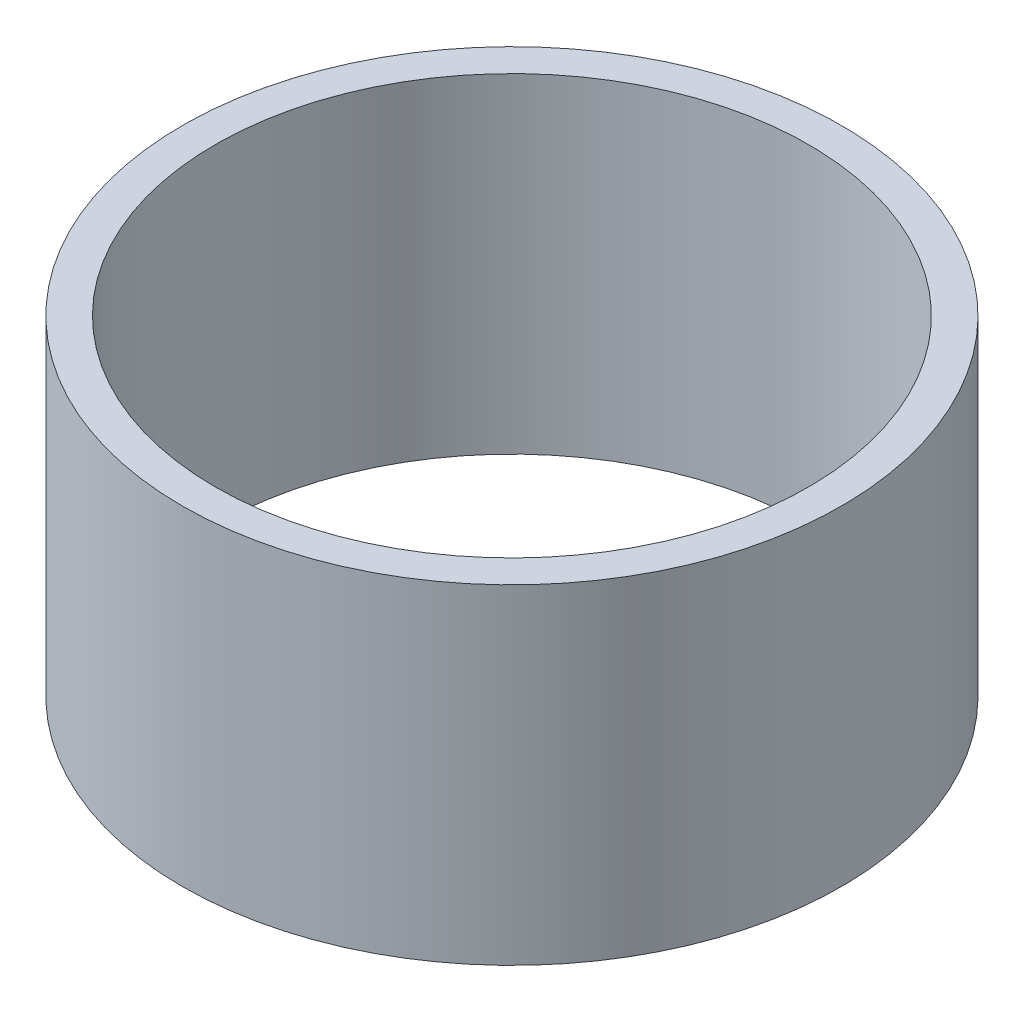
ISO-10303-21;
HEADER;
FILE_DESCRIPTION(('STEP AP214'),'2;1');
FILE_NAME('part.step','',(''),(''),'','','');
FILE_SCHEMA(('AUTOMOTIVE_DESIGN { 1 0 10303 214 1 1 1 1 }'));
ENDSEC;
DATA;
#1=APPLICATION_CONTEXT('core data for automotive mechanical design processes');
#2=APPLICATION_PROTOCOL_DEFINITION('international standard','automotive_design',2000,#1);
#3=PRODUCT_CONTEXT('',#1,'mechanical');
#4=PRODUCT('Part','Part','',(#3));
#5=PRODUCT_RELATED_PRODUCT_CATEGORY('part','',(#4));
#6=PRODUCT_DEFINITION_FORMATION('','',#4);
#7=PRODUCT_DEFINITION_CONTEXT('part definition',#1,'design');
#8=PRODUCT_DEFINITION('design','',#6,#7);
#9=PRODUCT_DEFINITION_SHAPE('','',#8);
#10=(LENGTH_UNIT() NAMED_UNIT(*) SI_UNIT(.MILLI.,.METRE.));
#11=(NAMED_UNIT(*) PLANE_ANGLE_UNIT() SI_UNIT($,.RADIAN.));
#12=(NAMED_UNIT(*) SI_UNIT($,.STERADIAN.) SOLID_ANGLE_UNIT());
#13=UNCERTAINTY_MEASURE_WITH_UNIT(LENGTH_MEASURE(1.E-05),#10,'distance_accuracy_value','');
#14=(GEOMETRIC_REPRESENTATION_CONTEXT(3) GLOBAL_UNCERTAINTY_ASSIGNED_CONTEXT((#13)) GLOBAL_UNIT_ASSIGNED_CONTEXT((#10,
#11,#12)) REPRESENTATION_CONTEXT('',''));
#15=CARTESIAN_POINT('',(0.,0.,0.));
#16=DIRECTION('',(0.,0.,1.));
#17=DIRECTION('',(1.,0.,0.));
#18=AXIS2_PLACEMENT_3D('',#15,#16,#17);
#19=CARTESIAN_POINT('',(0.,50.,0.));
#20=DIRECTION('',(0.,1.,0.));
#21=DIRECTION('',(0.,0.,1.));
#22=AXIS2_PLACEMENT_3D('',#19,#20,#21);
#23=PLANE('',#22);
#24=CARTESIAN_POINT('',(0.,50.,0.));
#25=DIRECTION('',(0.,1.,0.));
#26=DIRECTION('',(0.,0.,1.));
#27=AXIS2_PLACEMENT_3D('',#24,#25,#26);
#28=CIRCLE('',#27,50.);
#29=CARTESIAN_POINT('',(0.,50.,50.));
#30=VERTEX_POINT('',#29);
#31=EDGE_CURVE('E136',#30,#30,#28,.T.);
#32=ORIENTED_EDGE('',*,*,#31,.T.);
#33=EDGE_LOOP('',(#32));
#34=FACE_BOUND('',#33,.T.);
#35=CARTESIAN_POINT('',(0.,50.,0.));
#36=DIRECTION('',(0.,1.,0.));
#37=DIRECTION('',(0.,0.,1.));
#38=AXIS2_PLACEMENT_3D('',#35,#36,#37);
#39=CIRCLE('',#38,45.);
#40=CARTESIAN_POINT('',(0.,50.,45.));
#41=VERTEX_POINT('',#40);
#42=EDGE_CURVE('E129',#41,#41,#39,.T.);
#43=ORIENTED_EDGE('',*,*,#42,.F.);
#44=EDGE_LOOP('',(#43));
#45=FACE_BOUND('',#44,.T.);
#46=ADVANCED_FACE('F47',(#34,#45),#23,.T.);
#47=CARTESIAN_POINT('',(0.,0.,0.));
#48=DIRECTION('',(0.,1.,0.));
#49=DIRECTION('',(0.,0.,1.));
#50=AXIS2_PLACEMENT_3D('',#47,#48,#49);
#51=PLANE('',#50);
#52=CARTESIAN_POINT('',(0.,0.,36.6101500815682));
#53=DIRECTION('',(0.,-1.,0.));
#54=DIRECTION('',(0.,0.,-1.));
#55=AXIS2_PLACEMENT_3D('',#52,#53,#54);
#56=CIRCLE('',#55,5.15874);
#57=CARTESIAN_POINT('',(0.,0.,31.4514100815682));
#58=VERTEX_POINT('',#57);
#59=EDGE_CURVE('E256',#58,#58,#56,.T.);
#60=ORIENTED_EDGE('',*,*,#59,.F.);
#61=EDGE_LOOP('',(#60));
#62=FACE_BOUND('',#61,.T.);
#63=CARTESIAN_POINT('',(0.,0.,0.));
#64=DIRECTION('',(0.,1.,0.));
#65=DIRECTION('',(0.,0.,1.));
#66=AXIS2_PLACEMENT_3D('',#63,#64,#65);
#67=CIRCLE('',#66,50.);
#68=CARTESIAN_POINT('',(0.,0.,50.));
#69=VERTEX_POINT('',#68);
#70=EDGE_CURVE('E133',#69,#69,#67,.T.);
#71=ORIENTED_EDGE('',*,*,#70,.F.);
#72=EDGE_LOOP('',(#71));
#73=FACE_BOUND('',#72,.T.);
#74=CARTESIAN_POINT('',(0.,0.,0.));
#75=DIRECTION('',(0.,1.,0.));
#76=DIRECTION('',(0.,0.,1.));
#77=AXIS2_PLACEMENT_3D('',#74,#75,#76);
#78=CIRCLE('',#77,45.);
#79=CARTESIAN_POINT('',(12.7,0.,43.1707076615614));
#80=VERTEX_POINT('',#79);
#81=CARTESIAN_POINT('',(-12.7,0.,43.1707076615614));
#82=VERTEX_POINT('',#81);
#83=EDGE_CURVE('E102',#80,#82,#78,.T.);
#84=ORIENTED_EDGE('',*,*,#83,.T.);
#85=DIRECTION('',(0.,0.,-1.));
#86=VECTOR('',#85,1.);
#87=CARTESIAN_POINT('',(-12.7,0.,0.));
#88=LINE('',#87,#86);
#89=CARTESIAN_POINT('',(-12.7,0.,36.6101500815682));
#90=VERTEX_POINT('',#89);
#91=EDGE_CURVE('E95',#82,#90,#88,.T.);
#92=ORIENTED_EDGE('',*,*,#91,.T.);
#93=CARTESIAN_POINT('',(0.,0.,36.6101500815682));
#94=DIRECTION('',(0.,1.,0.));
#95=DIRECTION('',(0.,0.,1.));
#96=AXIS2_PLACEMENT_3D('',#93,#94,#95);
#97=CIRCLE('',#96,12.7);
#98=CARTESIAN_POINT('',(12.7,0.,36.6101500815682));
#99=VERTEX_POINT('',#98);
#100=EDGE_CURVE('E106',#99,#90,#97,.T.);
#101=ORIENTED_EDGE('',*,*,#100,.F.);
#102=DIRECTION('',(0.,0.,-1.));
#103=VECTOR('',#102,1.);
#104=CARTESIAN_POINT('',(12.7,0.,0.));
#105=LINE('',#104,#103);
#106=EDGE_CURVE('E115',#80,#99,#105,.T.);
#107=ORIENTED_EDGE('',*,*,#106,.F.);
#108=EDGE_LOOP('',(#84,#92,#101,#107));
#109=FACE_BOUND('',#108,.T.);
#110=ADVANCED_FACE('F112',(#62,#73,#109),#51,.F.);
#111=CARTESIAN_POINT('',(0.,50.,0.));
#112=DIRECTION('',(0.,-1.,0.));
#113=DIRECTION('',(0.,0.,-1.));
#114=AXIS2_PLACEMENT_3D('',#111,#112,#113);
#115=CYLINDRICAL_SURFACE('',#114,50.);
#116=ORIENTED_EDGE('',*,*,#31,.F.);
#117=EDGE_LOOP('',(#116));
#118=FACE_BOUND('',#117,.T.);
#119=ORIENTED_EDGE('',*,*,#70,.T.);
#120=EDGE_LOOP('',(#119));
#121=FACE_BOUND('',#120,.T.);
#122=ADVANCED_FACE('F170',(#118,#121),#115,.T.);
#123=CARTESIAN_POINT('',(0.,50.,0.));
#124=DIRECTION('',(0.,-1.,0.));
#125=DIRECTION('',(0.,0.,-1.));
#126=AXIS2_PLACEMENT_3D('',#123,#124,#125);
#127=CYLINDRICAL_SURFACE('',#126,45.);
#128=DIRECTION('',(0.,-1.,0.));
#129=VECTOR('',#128,1.);
#130=CARTESIAN_POINT('',(12.7,5.,43.1707076615614));
#131=LINE('',#130,#129);
#132=CARTESIAN_POINT('',(12.7,35.0000000000002,43.1707076615614));
#133=VERTEX_POINT('',#132);
#134=EDGE_CURVE('E123',#133,#80,#131,.T.);
#135=ORIENTED_EDGE('',*,*,#134,.F.);
#136=CARTESIAN_POINT('',(0.,35.0000000000002,0.));
#137=DIRECTION('',(0.,1.,0.));
#138=DIRECTION('',(0.,0.,1.));
#139=AXIS2_PLACEMENT_3D('',#136,#137,#138);
#140=CIRCLE('',#139,45.);
#141=CARTESIAN_POINT('',(-12.7,35.0000000000002,43.1707076615614));
#142=VERTEX_POINT('',#141);
#143=EDGE_CURVE('E140',#133,#142,#140,.F.);
#144=ORIENTED_EDGE('',*,*,#143,.T.);
#145=DIRECTION('',(0.,-1.,0.));
#146=VECTOR('',#145,1.);
#147=CARTESIAN_POINT('',(-12.7,5.,43.1707076615614));
#148=LINE('',#147,#146);
#149=EDGE_CURVE('E103',#142,#82,#148,.T.);
#150=ORIENTED_EDGE('',*,*,#149,.T.);
#151=ORIENTED_EDGE('',*,*,#83,.F.);
#152=EDGE_LOOP('',(#135,#144,#150,#151));
#153=FACE_BOUND('',#152,.T.);
#154=ORIENTED_EDGE('',*,*,#42,.T.);
#155=EDGE_LOOP('',(#154));
#156=FACE_BOUND('',#155,.T.);
#157=ADVANCED_FACE('F167',(#153,#156),#127,.F.);
#158=CARTESIAN_POINT('',(0.,5.,36.6101500815682));
#159=DIRECTION('',(0.,-1.,0.));
#160=DIRECTION('',(0.,0.,-1.));
#161=AXIS2_PLACEMENT_3D('',#158,#159,#160);
#162=CYLINDRICAL_SURFACE('',#161,12.7);
#163=ORIENTED_EDGE('',*,*,#100,.T.);
#164=DIRECTION('',(0.,-1.,0.));
#165=VECTOR('',#164,1.);
#166=CARTESIAN_POINT('',(-12.7,5.,36.6101500815682));
#167=LINE('',#166,#165);
#168=CARTESIAN_POINT('',(-12.7,28.7503946946991,36.6101500815682));
#169=VERTEX_POINT('',#168);
#170=EDGE_CURVE('E90',#169,#90,#167,.T.);
#171=ORIENTED_EDGE('',*,*,#170,.F.);
#172=CARTESIAN_POINT('',(-12.7,28.7503946946991,36.6101500815682));
#173=CARTESIAN_POINT('',(-12.6999922653262,28.513172893472,36.3590576179907));
#174=CARTESIAN_POINT('',(-12.6925537414756,28.2748341434454,36.1090944388542));
#175=CARTESIAN_POINT('',(-12.663156616301,27.7962604742258,35.6118884641788));
#176=CARTESIAN_POINT('',(-12.6411992163265,27.5560257135411,35.3646454452837));
#177=CARTESIAN_POINT('',(-12.5540788027013,26.8330892207903,34.6277947984313));
#178=CARTESIAN_POINT('',(-12.4676671016097,26.3479929715185,34.1428936420159));
#179=CARTESIAN_POINT('',(-12.2389407046088,25.3680971473796,33.1830383102579));
#180=CARTESIAN_POINT('',(-12.095890250895,24.8732547863921,32.7083054248262));
#181=CARTESIAN_POINT('',(-11.7555560175217,23.8834145637274,31.7788102730223));
#182=CARTESIAN_POINT('',(-11.558271869945,23.3884167010183,31.3240481421544));
#183=CARTESIAN_POINT('',(-11.1092028611528,22.3996799863462,30.4356414259774));
#184=CARTESIAN_POINT('',(-10.857173793942,21.9059571447142,30.0021024897511));
#185=CARTESIAN_POINT('',(-10.2985865078681,20.9262415097577,29.161391273466));
#186=CARTESIAN_POINT('',(-9.99200629699215,20.4402519204606,28.7542297179543));
#187=CARTESIAN_POINT('',(-9.49098223408561,19.7234464747141,28.1675905788065));
#188=CARTESIAN_POINT('',(-9.31764131135387,19.4871664932865,27.9765478650263));
#189=CARTESIAN_POINT('',(-8.95660496010887,19.0191109180492,27.6025527012946));
#190=CARTESIAN_POINT('',(-8.76890837101157,18.7873356903299,27.4196009073446));
#191=CARTESIAN_POINT('',(-8.37888563992011,18.3297928116435,27.0626854701264));
#192=CARTESIAN_POINT('',(-8.17657524529225,18.1040190423707,26.8887124883048));
#193=CARTESIAN_POINT('',(-7.75654859456847,17.6597926601407,26.5503954784911));
#194=CARTESIAN_POINT('',(-7.53883662687552,17.4413380340166,26.3860487932758));
#195=CARTESIAN_POINT('',(-7.12167074573794,17.0462739849511,26.0922334873718));
#196=CARTESIAN_POINT('',(-6.92450125786551,16.8683664957864,25.9612698290259));
#197=CARTESIAN_POINT('',(-6.51801818460892,16.5206452269798,25.7077271011594));
#198=CARTESIAN_POINT('',(-6.30870596796842,16.3508305390227,25.5851470900045));
#199=CARTESIAN_POINT('',(-5.87742534568287,16.0211283875659,25.3493234130555));
#200=CARTESIAN_POINT('',(-5.65546110367858,15.8612376939615,25.2360767054408));
#201=CARTESIAN_POINT('',(-5.19848691972995,15.5536398519924,25.0200815776086));
#202=CARTESIAN_POINT('',(-4.96347845218198,15.4059313313422,24.9173319746114));
#203=CARTESIAN_POINT('',(-4.31363939936346,15.0288499219311,24.6571064011031));
#204=CARTESIAN_POINT('',(-3.88607302410239,14.8129901862356,24.5104587101472));
#205=CARTESIAN_POINT('',(-3.21787122334546,14.5334252209164,24.3223969248805));
#206=CARTESIAN_POINT('',(-2.99074630283212,14.4476300249455,24.2650424870577));
#207=CARTESIAN_POINT('',(-2.52816000882595,14.2929535997945,24.1620797198145));
#208=CARTESIAN_POINT('',(-2.29270079831681,14.224068018388,24.1164683677899));
#209=CARTESIAN_POINT('',(-1.86133068427518,14.1169661248711,24.0457748458819));
#210=CARTESIAN_POINT('',(-1.6666194297696,14.0753917737449,24.0184260840143));
#211=CARTESIAN_POINT('',(-1.27378542037653,14.0056736008079,23.9726446154819));
#212=CARTESIAN_POINT('',(-1.07566340190389,13.9775269166056,23.9542100085649));
#213=CARTESIAN_POINT('',(-0.677391816726672,13.9354230012076,23.9266584820263));
#214=CARTESIAN_POINT('',(-0.477243608840231,13.9214568242515,23.9175356880367));
#215=CARTESIAN_POINT('',(-0.076244597202574,13.9080771688714,23.9087956871048));
#216=CARTESIAN_POINT('',(0.12460622221837,13.9086640171064,23.909178693531));
#217=CARTESIAN_POINT('',(0.525462663568599,13.9243737444667,23.9194415243193));
#218=CARTESIAN_POINT('',(0.725468395511942,13.939494669065,23.9293200717314));
#219=CARTESIAN_POINT('',(1.12321277374355,13.9838413069957,23.958345448826));
#220=CARTESIAN_POINT('',(1.32095145158096,14.0130668237988,23.9774921493688));
#221=CARTESIAN_POINT('',(1.71304934698804,14.0848755134322,24.0246629737048));
#222=CARTESIAN_POINT('',(1.90740594708407,14.1274685853456,24.0526936765253));
#223=CARTESIAN_POINT('',(2.29160662652151,14.2249866293189,24.1170916531668));
#224=CARTESIAN_POINT('',(2.4814495374418,14.279914756831,24.1534610601764));
#225=CARTESIAN_POINT('',(2.92224650372724,14.4224152323972,24.2482037708956));
#226=CARTESIAN_POINT('',(3.17100764195036,14.5146571926847,24.3098069440772));
#227=CARTESIAN_POINT('',(3.65766803932874,14.7166755981488,24.4456370270336));
#228=CARTESIAN_POINT('',(3.89556346145486,14.8264581768493,24.5198683531536));
#229=CARTESIAN_POINT('',(4.59301506979298,15.1782616982576,24.7595738459641));
#230=CARTESIAN_POINT('',(5.03572399799067,15.442527756191,24.9419214748238));
#231=CARTESIAN_POINT('',(5.78739434425874,15.951369420988,25.2994845580759));
#232=CARTESIAN_POINT('',(6.10489655887685,16.188386244664,25.4681260840143));
#233=CARTESIAN_POINT('',(6.71388531877137,16.6814290757017,25.8241365219378));
#234=CARTESIAN_POINT('',(7.00535676578693,16.9374659593242,26.0115161704929));
#235=CARTESIAN_POINT('',(7.5641369067151,17.4640823306432,26.4027787363814));
#236=CARTESIAN_POINT('',(7.83139725937793,17.7346892646944,26.6066931946145));
#237=CARTESIAN_POINT('',(8.3425461691111,18.2864283261476,27.0288283385816));
#238=CARTESIAN_POINT('',(8.58643652233978,18.5675596423593,27.2470479226858));
#239=CARTESIAN_POINT('',(9.17205715434957,19.2846510292037,27.8121999319482));
#240=CARTESIAN_POINT('',(9.49945485603647,19.7257547009377,28.1675206833903));
#241=CARTESIAN_POINT('',(10.1061250268641,20.6194501076435,28.9040570101673));
#242=CARTESIAN_POINT('',(10.3853736229879,21.0720474144658,29.2852853009861));
#243=CARTESIAN_POINT('',(10.896954376588,21.9839308768814,30.0705814114236));
#244=CARTESIAN_POINT('',(11.1292813727882,22.4432177623633,30.4746517373675));
#245=CARTESIAN_POINT('',(11.5471952655592,23.3647114501026,31.3028599845982));
#246=CARTESIAN_POINT('',(11.7327939278478,23.8269174872415,31.726992822336));
#247=CARTESIAN_POINT('',(12.0265211599208,24.6651540360284,32.5120830980807));
#248=CARTESIAN_POINT('',(12.142641851213,25.0411850612334,32.8700763433697));
#249=CARTESIAN_POINT('',(12.342942399667,25.7918323696935,33.5962498849897));
#250=CARTESIAN_POINT('',(12.4271271879203,26.1664488625097,33.9644285991972));
#251=CARTESIAN_POINT('',(12.5624519126592,26.9116922320415,34.7082416635517));
#252=CARTESIAN_POINT('',(12.6137031966534,27.2823283414719,35.0838464181466));
#253=CARTESIAN_POINT('',(12.6824646090196,28.0196708133447,35.8421359213681));
#254=CARTESIAN_POINT('',(12.6999650074322,28.3863760122651,36.2248226795566));
#255=CARTESIAN_POINT('',(12.7,28.7503946946991,36.6101500815682));
#256=B_SPLINE_CURVE_WITH_KNOTS('',3,(#172,#173,#174,#175,#176,#177,#178,#179,#180,#181,#182,
#183,#184,#185,#186,#187,#188,#189,#190,#191,#192,#193,#194,#195,#196,#197,#198,#199,#200,#201,
#202,#203,#204,#205,#206,#207,#208,#209,#210,#211,#212,#213,#214,#215,#216,#217,#218,#219,#220,
#221,#222,#223,#224,#225,#226,#227,#228,#229,#230,#231,#232,#233,#234,#235,#236,#237,#238,#239,
#240,#241,#242,#243,#244,#245,#246,#247,#248,#249,#250,#251,#252,#253,#254,#255),.UNSPECIFIED.,
.F.,.F.,(4,2,2,2,2,2,2,2,2,2,2,2,2,2,2,2,2,2,2,2,2,2,2,2,2,2,2,2,2,2,2,2,2,2,2,2,2,2,2,2,2,4),
(0.,1.03610561183357,2.07212550290628,4.14345828136957,6.24263094801393,8.34181785562873,
10.4505684914154,12.5601711932939,13.6092892829713,14.6584922784491,15.7065810839719,
16.7543792003782,17.6422659669725,18.5300528435908,19.417549227545,20.304945500744,
21.80127065071,22.5489088208235,23.2963543602609,23.8986473246756,24.5008118401567,
25.1025962442222,25.7043941560284,26.3061111500239,26.9078197601207,27.5099750094164,
28.1122844729237,28.9281061806807,29.7442137881265,31.3783918733322,32.6686838590466,
33.9597194391152,35.2532784353479,36.54673793207,38.5066184113111,40.4674678504285,
42.4285328614728,44.3891036014279,45.9841494462735,47.5789489063117,49.1683276105114,
50.7581644443099),.UNSPECIFIED.);
#257=CARTESIAN_POINT('',(12.7,28.7503946946991,36.6101500815682));
#258=VERTEX_POINT('',#257);
#259=EDGE_CURVE('E64',#169,#258,#256,.T.);
#260=ORIENTED_EDGE('',*,*,#259,.T.);
#261=DIRECTION('',(0.,-1.,0.));
#262=VECTOR('',#261,1.);
#263=CARTESIAN_POINT('',(12.7,5.,36.6101500815682));
#264=LINE('',#263,#262);
#265=EDGE_CURVE('E70',#258,#99,#264,.T.);
#266=ORIENTED_EDGE('',*,*,#265,.T.);
#267=EDGE_LOOP('',(#163,#171,#260,#266));
#268=FACE_BOUND('',#267,.T.);
#269=ADVANCED_FACE('F107',(#268),#162,.T.);
#270=CARTESIAN_POINT('',(-12.7,5.,0.));
#271=DIRECTION('',(-1.,0.,0.));
#272=DIRECTION('',(0.,0.,1.));
#273=AXIS2_PLACEMENT_3D('',#270,#271,#272);
#274=PLANE('',#273);
#275=ORIENTED_EDGE('',*,*,#91,.F.);
#276=ORIENTED_EDGE('',*,*,#149,.F.);
#277=CARTESIAN_POINT('',(-12.7,35.0000000000002,43.1707076615614));
#278=CARTESIAN_POINT('',(-12.7,34.4772907832101,42.6258444788525));
#279=CARTESIAN_POINT('',(-12.7,33.9549869135523,42.0805920967545));
#280=CARTESIAN_POINT('',(-12.7,32.9113009494832,40.9892096792977));
#281=CARTESIAN_POINT('',(-12.7,32.3899188517437,40.4430796471215));
#282=CARTESIAN_POINT('',(-12.7,31.3481543869389,39.3498079414927));
#283=CARTESIAN_POINT('',(-12.7,30.827772077845,38.8026662127853));
#284=CARTESIAN_POINT('',(-12.7,29.7881735975068,37.7072723386415));
#285=CARTESIAN_POINT('',(-12.7,29.2689574304925,37.1590201891908));
#286=CARTESIAN_POINT('',(-12.7,28.7503946946991,36.6101500815682));
#287=B_SPLINE_CURVE_WITH_KNOTS('',3,(#277,#278,#279,#280,#281,#282,#283,#284,#285,#286),
.UNSPECIFIED.,.F.,.F.,(4,2,2,2,4),(0.,2.26515075166511,4.53029330773328,6.79556346384886,
9.06084182366669),.UNSPECIFIED.);
#288=EDGE_CURVE('E98',#142,#169,#287,.T.);
#289=ORIENTED_EDGE('',*,*,#288,.T.);
#290=ORIENTED_EDGE('',*,*,#170,.T.);
#291=EDGE_LOOP('',(#275,#276,#289,#290));
#292=FACE_BOUND('',#291,.T.);
#293=ADVANCED_FACE('F92',(#292),#274,.T.);
#294=CARTESIAN_POINT('',(12.7,5.,0.));
#295=DIRECTION('',(-1.,0.,0.));
#296=DIRECTION('',(0.,0.,1.));
#297=AXIS2_PLACEMENT_3D('',#294,#295,#296);
#298=PLANE('',#297);
#299=ORIENTED_EDGE('',*,*,#106,.T.);
#300=ORIENTED_EDGE('',*,*,#265,.F.);
#301=CARTESIAN_POINT('',(12.7,28.7503946946991,36.6101500815682));
#302=CARTESIAN_POINT('',(12.7,29.268943019706,37.1590049368888));
#303=CARTESIAN_POINT('',(12.7,29.7881447401122,37.7072418679363));
#304=CARTESIAN_POINT('',(12.7,30.8277142663385,38.8026053633827));
#305=CARTESIAN_POINT('',(12.7,31.3480820679289,39.3497319317955));
#306=CARTESIAN_POINT('',(12.7,32.3898464178416,40.4430037468861));
#307=CARTESIAN_POINT('',(12.7,32.9112429653912,40.9891489943003));
#308=CARTESIAN_POINT('',(12.7,33.9549578833284,42.0805617906718));
#309=CARTESIAN_POINT('',(12.7,34.4772762570446,42.6258293364463));
#310=CARTESIAN_POINT('',(12.7,35.0000000000002,43.1707076615614));
#311=B_SPLINE_CURVE_WITH_KNOTS('',3,(#301,#302,#303,#304,#305,#306,#307,#308,#309,#310),
.UNSPECIFIED.,.F.,.F.,(4,2,2,2,4),(0.,2.26521540968607,4.53042261609114,6.79562812184347,
9.0608418236847),.UNSPECIFIED.);
#312=EDGE_CURVE('E11',#258,#133,#311,.T.);
#313=ORIENTED_EDGE('',*,*,#312,.T.);
#314=ORIENTED_EDGE('',*,*,#134,.T.);
#315=EDGE_LOOP('',(#299,#300,#313,#314));
#316=FACE_BOUND('',#315,.T.);
#317=ADVANCED_FACE('F162',(#316),#298,.F.);
#318=CARTESIAN_POINT('',(0.,5.,0.));
#319=DIRECTION('',(0.,1.,0.));
#320=DIRECTION('',(0.,0.,1.));
#321=AXIS2_PLACEMENT_3D('',#318,#319,#320);
#322=CONICAL_SURFACE('',#321,14.9999999999995,0.785398163397453);
#323=CARTESIAN_POINT('',(-2.0760998355559,21.9551201919416,31.8876075606887));
#324=CARTESIAN_POINT('',(-1.90410873840228,21.8685089655743,31.8120092873212));
#325=CARTESIAN_POINT('',(-1.72423742302308,21.7904316329784,31.7441682335421));
#326=CARTESIAN_POINT('',(-1.44416507014759,21.689497768323,31.6567073902118));
#327=CARTESIAN_POINT('',(-1.3490372759487,21.6585366220404,31.6299256035995));
#328=CARTESIAN_POINT('',(-1.15577452638115,21.60256009186,31.5815628719314));
#329=CARTESIAN_POINT('',(-1.05764087922711,21.5775421617114,31.5599796995789));
#330=CARTESIAN_POINT('',(-0.858141307765558,21.5337863865859,31.5222647935317));
#331=CARTESIAN_POINT('',(-0.7567565285478,21.5150975540666,31.5061755975118));
#332=CARTESIAN_POINT('',(-0.552216516137513,21.4846938080666,31.4800157561977));
#333=CARTESIAN_POINT('',(-0.449062072942697,21.4729758619756,31.4699424937277));
#334=CARTESIAN_POINT('',(-0.241805488475297,21.4567932583081,31.456034205717));
#335=CARTESIAN_POINT('',(-0.137703744577915,21.4523256886983,31.4521966756627));
#336=CARTESIAN_POINT('',(0.070592490917112,21.4507485437319,31.4508417562777));
#337=CARTESIAN_POINT('',(0.174786977470442,21.4536385900403,31.4533240419766));
#338=CARTESIAN_POINT('',(0.374552413479825,21.4662109903393,31.4641278991149));
#339=CARTESIAN_POINT('',(0.470181644953703,21.4753652124158,31.4719954531382));
#340=CARTESIAN_POINT('',(0.660099333362223,21.4996970228193,31.4929227827879));
#341=CARTESIAN_POINT('',(0.754387361038701,21.5148764965385,31.5059841836497));
#342=CARTESIAN_POINT('',(1.03437317995254,21.5690506339537,31.5526447108831));
#343=CARTESIAN_POINT('',(1.21727846604472,21.6166867825377,31.5937250853279));
#344=CARTESIAN_POINT('',(1.50843219949976,21.7111355478107,31.675440547444));
#345=CARTESIAN_POINT('',(1.62009780451619,21.752216049459,31.7110381720901));
#346=CARTESIAN_POINT('',(1.83822862759557,21.8415724364259,31.7886461756353));
#347=CARTESIAN_POINT('',(1.94469248082232,21.8898501968435,31.8306582257512));
#348=CARTESIAN_POINT('',(2.25595887069897,22.0442013184015,31.9653267437625));
#349=CARTESIAN_POINT('',(2.45246783815865,22.1597355320665,32.0665665010365));
#350=CARTESIAN_POINT('',(2.76830280179715,22.372759643719,32.2544182995962));
#351=CARTESIAN_POINT('',(2.89344925301184,22.4657179251274,32.3367148589826));
#352=CARTESIAN_POINT('',(3.13244591328302,22.6590630338603,32.5086834542597));
#353=CARTESIAN_POINT('',(3.24629599200094,22.7594499468736,32.5983555752284));
#354=CARTESIAN_POINT('',(3.46320319589156,22.9662893934145,32.7840230333875));
#355=CARTESIAN_POINT('',(3.56624177917076,23.0727518791551,32.880028788116));
#356=CARTESIAN_POINT('',(3.76173885330847,23.2903811955853,33.0772765794316));
#357=CARTESIAN_POINT('',(3.85419738635421,23.4015480075143,33.1785185951372));
#358=CARTESIAN_POINT('',(4.06638617812143,23.6760523250009,33.429813308789));
#359=CARTESIAN_POINT('',(4.1808394668362,23.8413446738974,33.5822020512881));
#360=CARTESIAN_POINT('',(4.39003381460921,24.1773757444888,33.8943602391476));
#361=CARTESIAN_POINT('',(4.48476676464043,24.3481166734952,34.0541326878273));
#362=CARTESIAN_POINT('',(4.6552865828644,24.6934396645054,34.3797472721131));
#363=CARTESIAN_POINT('',(4.73106087340657,24.8680241933433,34.5455933539369));
#364=CARTESIAN_POINT('',(4.86406025234667,25.2195474611923,34.8820765696674));
#365=CARTESIAN_POINT('',(4.92128762728201,25.3964859072011,35.0527131101668));
#366=CARTESIAN_POINT('',(5.01865386106936,25.7560379453724,35.4020895231076));
#367=CARTESIAN_POINT('',(5.05833131439665,25.9386830789373,35.580925363772));
#368=CARTESIAN_POINT('',(5.11849883738987,26.3042130250729,35.9415757499245));
#369=CARTESIAN_POINT('',(5.13898757678354,26.4870978533806,36.123390501039));
#370=CARTESIAN_POINT('',(5.16056264907355,26.8520288314687,36.4889140212764));
#371=CARTESIAN_POINT('',(5.16165421368501,27.0340751941522,36.6726222663192));
#372=CARTESIAN_POINT('',(5.14403130472807,27.3963370022978,37.0408711099352));
#373=CARTESIAN_POINT('',(5.12531893875628,27.5765526405307,37.2254116178554));
#374=CARTESIAN_POINT('',(5.07002206129408,27.9182770622691,37.577825973439));
#375=CARTESIAN_POINT('',(5.03516498494484,28.0800304124138,37.7457300643019));
#376=CARTESIAN_POINT('',(4.94789891738835,28.4001585898784,38.0801081766546));
#377=CARTESIAN_POINT('',(4.89548901714131,28.5585332417677,38.246582123621));
#378=CARTESIAN_POINT('',(4.71089935088914,29.0268312968131,38.74181542615));
#379=CARTESIAN_POINT('',(4.55126281711956,29.3305700382383,39.0670486396945));
#380=CARTESIAN_POINT('',(4.20487752930882,29.833450245535,39.6112589383387));
#381=CARTESIAN_POINT('',(4.03619152693289,30.0391457348564,39.8357490905684));
#382=CARTESIAN_POINT('',(3.65310686608737,30.4287045684108,40.2638740207811));
#383=CARTESIAN_POINT('',(3.438770804343,30.6125972771245,40.4675367975024));
#384=CARTESIAN_POINT('',(3.014307804697,30.9140927187224,40.803380369086));
#385=CARTESIAN_POINT('',(2.81309177055174,31.0374605341008,40.9415320980085));
#386=CARTESIAN_POINT('',(2.49092124910892,31.2045844896626,41.1293746530335));
#387=CARTESIAN_POINT('',(2.38014668491872,31.2573020940149,41.1887552505669));
#388=CARTESIAN_POINT('',(2.15214095534861,31.3561135624464,41.3002428957279));
#389=CARTESIAN_POINT('',(2.03491086947577,31.4022085293535,41.3523511543328));
#390=CARTESIAN_POINT('',(1.81259674642965,31.4807079012163,41.4412165568218));
#391=CARTESIAN_POINT('',(1.70832140808765,31.5141287917747,41.4791040137126));
#392=CARTESIAN_POINT('',(1.49603331058038,31.5752505162602,41.5484640864922));
#393=CARTESIAN_POINT('',(1.38802120459765,31.6029523440332,41.5799378169317));
#394=CARTESIAN_POINT('',(1.16886706692892,31.6522548001089,41.6359971895357));
#395=CARTESIAN_POINT('',(1.05772536282117,31.6738560643725,41.6605835496806));
#396=CARTESIAN_POINT('',(0.833069358651905,31.7106299522444,41.7024622414897));
#397=CARTESIAN_POINT('',(0.719556014579835,31.7258051156341,41.7197574548146));
#398=CARTESIAN_POINT('',(0.490495107691561,31.749541813252,41.7468186182591));
#399=CARTESIAN_POINT('',(0.374941367750037,31.7580774976238,41.7565551394127));
#400=CARTESIAN_POINT('',(0.143181986250333,31.7682918941576,41.7682072485454));
#401=CARTESIAN_POINT('',(0.026976618294907,31.7699732957168,41.770125904));
#402=CARTESIAN_POINT('',(-0.205214331666145,31.7664573451543,41.7661145879902));
#403=CARTESIAN_POINT('',(-0.321199870571836,31.761258760763,41.7601832105117));
#404=CARTESIAN_POINT('',(-0.552000692739948,31.7440697283564,41.7405797012834));
#405=CARTESIAN_POINT('',(-0.666816010775003,31.732079482755,41.7269078002267));
#406=CARTESIAN_POINT('',(-0.887956873895176,31.7023706442184,41.6930549857515));
#407=CARTESIAN_POINT('',(-0.994394818227846,31.6850151645679,41.67328682396));
#408=CARTESIAN_POINT('',(-1.20481515226748,31.6446809498375,41.6273838218306));
#409=CARTESIAN_POINT('',(-1.30879673828409,31.6217004014981,41.6012469285235));
#410=CARTESIAN_POINT('',(-1.61609387070603,31.5447633519385,41.5138314773739));
#411=CARTESIAN_POINT('',(-1.81494022141259,31.4827868555638,41.4435200341314));
#412=CARTESIAN_POINT('',(-2.21111291534549,31.3349846756124,41.2763349452203));
#413=CARTESIAN_POINT('',(-2.40721526264457,31.247722885436,41.177868999551));
#414=CARTESIAN_POINT('',(-2.77896811586567,31.0554377916473,40.96173021698));
#415=CARTESIAN_POINT('',(-2.95460598322104,30.9504036092148,40.8440456175216));
#416=CARTESIAN_POINT('',(-3.36643142508399,30.6700658724352,40.5313381313089));
#417=CARTESIAN_POINT('',(-3.5894505632835,30.4857462226917,40.3269047559058));
#418=CARTESIAN_POINT('',(-3.88825743497457,30.1920064168482,40.0036347293738));
#419=CARTESIAN_POINT('',(-3.98201859645736,30.0910536812962,39.8929313188074));
#420=CARTESIAN_POINT('',(-4.15797014770336,29.8842097498958,39.6670042274619));
#421=CARTESIAN_POINT('',(-4.24015957864461,29.7783181457843,39.5517801731171));
#422=CARTESIAN_POINT('',(-4.52048498002646,29.3829554584552,39.1233801621672));
#423=CARTESIAN_POINT('',(-4.68459155826854,29.0805581671194,38.7991383339944));
#424=CARTESIAN_POINT('',(-4.87552722213801,28.6141159743872,38.3051680311296));
#425=CARTESIAN_POINT('',(-4.9299864395126,28.4563836382238,38.1391289486832));
#426=CARTESIAN_POINT('',(-5.02131238079441,28.1374619962767,37.8055143178016));
#427=CARTESIAN_POINT('',(-5.05818052862225,27.976272971401,37.6379388948461));
#428=CARTESIAN_POINT('',(-5.14447481938762,27.4821426725668,37.127571905956));
#429=CARTESIAN_POINT('',(-5.16705220269092,27.1450039625797,36.7838929572181));
#430=CARTESIAN_POINT('',(-5.15053556245429,26.636851336732,36.2730055783111));
#431=CARTESIAN_POINT('',(-5.13659966949168,26.4669146667443,36.1033398289957));
#432=CARTESIAN_POINT('',(-5.09209074188752,26.1269631301342,35.7662990042396));
#433=CARTESIAN_POINT('',(-5.06152270032886,25.9569483022725,35.5989232567765));
#434=CARTESIAN_POINT('',(-4.9765087699074,25.5858258318123,35.236141986939));
#435=CARTESIAN_POINT('',(-4.91865819894887,25.384871280789,35.0413714706912));
#436=CARTESIAN_POINT('',(-4.77930165417635,24.9855262142704,34.6575698292088));
#437=CARTESIAN_POINT('',(-4.69778768714098,24.787136588869,34.4685406672097));
#438=CARTESIAN_POINT('',(-4.51053019724341,24.3949896851264,34.09802171941));
#439=CARTESIAN_POINT('',(-4.40480071198489,24.2012297945378,33.9165276372895));
#440=CARTESIAN_POINT('',(-4.16808050239934,23.8207171597167,33.563032046295));
#441=CARTESIAN_POINT('',(-4.03710837330069,23.6339593775494,33.3910236689178));
#442=CARTESIAN_POINT('',(-3.80651494105891,23.3437628927197,33.1258570607386));
#443=CARTESIAN_POINT('',(-3.71547536533336,23.2370280269299,33.0288137023945));
#444=CARTESIAN_POINT('',(-3.52348208729584,23.0281321059048,32.8397595509056));
#445=CARTESIAN_POINT('',(-3.42252668954875,22.9259718372097,32.7477496225929));
#446=CARTESIAN_POINT('',(-3.10504353588679,22.6288072771204,32.481303494046));
#447=CARTESIAN_POINT('',(-2.87298832068838,22.4419404196175,32.3153765207824));
#448=CARTESIAN_POINT('',(-2.44816920367693,22.1578872100229,32.064971912674));
#449=CARTESIAN_POINT('',(-2.26698801224569,22.0512476040909,31.9715119999465));
#450=CARTESIAN_POINT('',(-2.0760998355559,21.9551201919416,31.8876075606887));
#451=B_SPLINE_CURVE_WITH_KNOTS('',3,(#323,#324,#325,#326,#327,#328,#329,#330,#331,#332,#333,
#334,#335,#336,#337,#338,#339,#340,#341,#342,#343,#344,#345,#346,#347,#348,#349,#350,#351,#352,
#353,#354,#355,#356,#357,#358,#359,#360,#361,#362,#363,#364,#365,#366,#367,#368,#369,#370,#371,
#372,#373,#374,#375,#376,#377,#378,#379,#380,#381,#382,#383,#384,#385,#386,#387,#388,#389,#390,
#391,#392,#393,#394,#395,#396,#397,#398,#399,#400,#401,#402,#403,#404,#405,#406,#407,#408,#409,
#410,#411,#412,#413,#414,#415,#416,#417,#418,#419,#420,#421,#422,#423,#424,#425,#426,#427,#428,
#429,#430,#431,#432,#433,#434,#435,#436,#437,#438,#439,#440,#441,#442,#443,#444,#445,#446,#447,
#448,#449,#450),.UNSPECIFIED.,.T.,.F.,(4,2,2,2,2,2,2,2,2,2,2,2,2,2,2,2,2,2,2,2,2,2,2,2,2,2,2,2,
2,2,2,2,2,2,2,2,2,2,2,2,2,2,2,2,2,2,2,2,2,2,2,2,2,2,2,2,2,2,2,2,2,2,2,4),(0.,0.620064219841456,
0.930464589954894,1.24073173448974,1.55334939809174,1.86583096104479,2.17818698815086,
2.4905269539638,2.77933543347229,3.0682343568477,3.64577700264911,4.01792264533051,
4.39016541295948,5.13519724920626,5.66344057625412,6.19168999751293,6.72083105605577,
7.24997000461139,8.00570629421187,8.76175273229343,9.51829942845231,10.274752819019,
11.0500578299417,11.8254165854987,12.6005662117491,13.3756333524317,14.0821366753829,
14.7886765929573,16.1990036560337,17.2398089887332,18.2791962223287,19.0962030203587,
19.5046612483768,19.9130513792779,20.2603086117079,20.6075054476713,20.9546660762929,
21.3016893686106,21.6500570760745,21.998288082242,22.3465814682715,22.6948644745547,
23.023411201795,23.3520639769557,24.0088288441347,24.7146723586288,25.4209495068512,
26.4774864707348,27.0073303402302,27.5372180862514,28.9467851705077,29.6525199128816,
30.3581975194,31.7981372150367,32.5193303045975,33.2403070065026,34.096597183007,
34.9531769416584,35.8092613969062,36.6647176034956,37.1760591123026,37.6874882044249,
38.7048848146169,39.3930769961598),.UNSPECIFIED.);
#452=CARTESIAN_POINT('',(-2.0760998355559,21.9551201919416,31.8876075606887));
#453=VERTEX_POINT('',#452);
#454=EDGE_CURVE('E53',#453,#453,#451,.T.);
#455=ORIENTED_EDGE('',*,*,#454,.T.);
#456=EDGE_LOOP('',(#455));
#457=FACE_BOUND('',#456,.T.);
#458=ORIENTED_EDGE('',*,*,#288,.F.);
#459=ORIENTED_EDGE('',*,*,#143,.F.);
#460=ORIENTED_EDGE('',*,*,#312,.F.);
#461=ORIENTED_EDGE('',*,*,#259,.F.);
#462=EDGE_LOOP('',(#458,#459,#460,#461));
#463=FACE_BOUND('',#462,.T.);
#464=ADVANCED_FACE('F50',(#457,#463),#322,.F.);
#465=CARTESIAN_POINT('',(0.,0.,36.6101500815682));
#466=DIRECTION('',(0.,-1.,0.));
#467=DIRECTION('',(0.,0.,-1.));
#468=AXIS2_PLACEMENT_3D('',#465,#466,#467);
#469=CYLINDRICAL_SURFACE('',#468,5.15874);
#470=ORIENTED_EDGE('',*,*,#59,.T.);
#471=EDGE_LOOP('',(#470));
#472=FACE_BOUND('',#471,.T.);
#473=ORIENTED_EDGE('',*,*,#454,.F.);
#474=EDGE_LOOP('',(#473));
#475=FACE_BOUND('',#474,.T.);
#476=ADVANCED_FACE('F223',(#472,#475),#469,.F.);
#477=CLOSED_SHELL('',(#46,#110,#122,#157,#269,#293,#317,#464,#476));
#478=MANIFOLD_SOLID_BREP('B2',#477);
#479=ADVANCED_BREP_SHAPE_REPRESENTATION('',(#18,#478),#14);
#480=SHAPE_DEFINITION_REPRESENTATION(#9,#479);
ENDSEC;
END-ISO-10303-21;
